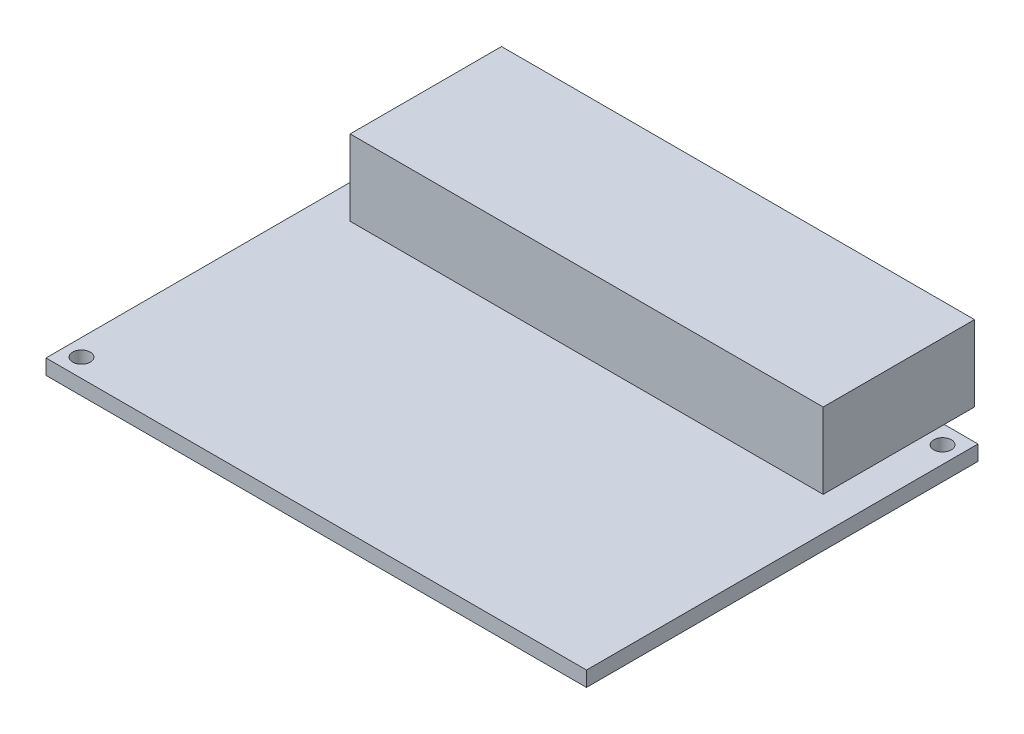
ISO-10303-21;
HEADER;
FILE_DESCRIPTION(('STEP AP214'),'2;1');
FILE_NAME('part.step','',(''),(''),'','','');
FILE_SCHEMA(('AUTOMOTIVE_DESIGN { 1 0 10303 214 1 1 1 1 }'));
ENDSEC;
DATA;
#1=APPLICATION_CONTEXT('core data for automotive mechanical design processes');
#2=APPLICATION_PROTOCOL_DEFINITION('international standard','automotive_design',2000,#1);
#3=PRODUCT_CONTEXT('',#1,'mechanical');
#4=PRODUCT('Part','Part','',(#3));
#5=PRODUCT_RELATED_PRODUCT_CATEGORY('part','',(#4));
#6=PRODUCT_DEFINITION_FORMATION('','',#4);
#7=PRODUCT_DEFINITION_CONTEXT('part definition',#1,'design');
#8=PRODUCT_DEFINITION('design','',#6,#7);
#9=PRODUCT_DEFINITION_SHAPE('','',#8);
#10=(LENGTH_UNIT() NAMED_UNIT(*) SI_UNIT(.MILLI.,.METRE.));
#11=(NAMED_UNIT(*) PLANE_ANGLE_UNIT() SI_UNIT($,.RADIAN.));
#12=(NAMED_UNIT(*) SI_UNIT($,.STERADIAN.) SOLID_ANGLE_UNIT());
#13=UNCERTAINTY_MEASURE_WITH_UNIT(LENGTH_MEASURE(1.E-05),#10,'distance_accuracy_value','');
#14=(GEOMETRIC_REPRESENTATION_CONTEXT(3) GLOBAL_UNCERTAINTY_ASSIGNED_CONTEXT((#13)) GLOBAL_UNIT_ASSIGNED_CONTEXT((#10,
#11,#12)) REPRESENTATION_CONTEXT('',''));
#15=CARTESIAN_POINT('',(0.,0.,0.));
#16=DIRECTION('',(0.,0.,1.));
#17=DIRECTION('',(1.,0.,0.));
#18=AXIS2_PLACEMENT_3D('',#15,#16,#17);
#19=CARTESIAN_POINT('',(0.,2.54,0.));
#20=DIRECTION('',(0.,-1.,0.));
#21=DIRECTION('',(0.,0.,-1.));
#22=AXIS2_PLACEMENT_3D('',#19,#20,#21);
#23=PLANE('',#22);
#24=CARTESIAN_POINT('',(-42.4999999999999,2.54,29.75));
#25=DIRECTION('',(0.,1.,0.));
#26=DIRECTION('',(0.,0.,1.));
#27=AXIS2_PLACEMENT_3D('',#24,#25,#26);
#28=CIRCLE('',#27,1.4732);
#29=CARTESIAN_POINT('',(-42.4999999999999,2.54,31.2232));
#30=VERTEX_POINT('',#29);
#31=EDGE_CURVE('E127',#30,#30,#28,.T.);
#32=ORIENTED_EDGE('',*,*,#31,.F.);
#33=EDGE_LOOP('',(#32));
#34=FACE_BOUND('',#33,.T.);
#35=CARTESIAN_POINT('',(-42.4999999999999,2.54,-29.75));
#36=DIRECTION('',(0.,1.,0.));
#37=DIRECTION('',(0.,0.,1.));
#38=AXIS2_PLACEMENT_3D('',#35,#36,#37);
#39=CIRCLE('',#38,1.4732);
#40=CARTESIAN_POINT('',(-42.4999999999999,2.54,-28.2768));
#41=VERTEX_POINT('',#40);
#42=EDGE_CURVE('E142',#41,#41,#39,.T.);
#43=ORIENTED_EDGE('',*,*,#42,.F.);
#44=EDGE_LOOP('',(#43));
#45=FACE_BOUND('',#44,.T.);
#46=CARTESIAN_POINT('',(42.5000000000001,2.54,-29.7500000000001));
#47=DIRECTION('',(0.,1.,0.));
#48=DIRECTION('',(0.,0.,1.));
#49=AXIS2_PLACEMENT_3D('',#46,#47,#48);
#50=CIRCLE('',#49,1.4732);
#51=CARTESIAN_POINT('',(42.5000000000001,2.54,-28.2768000000001));
#52=VERTEX_POINT('',#51);
#53=EDGE_CURVE('E136',#52,#52,#50,.T.);
#54=ORIENTED_EDGE('',*,*,#53,.F.);
#55=EDGE_LOOP('',(#54));
#56=FACE_BOUND('',#55,.T.);
#57=DIRECTION('',(0.,0.,1.));
#58=VECTOR('',#57,1.);
#59=CARTESIAN_POINT('',(-39.6875,2.54,-12.53));
#60=LINE('',#59,#58);
#61=CARTESIAN_POINT('',(-39.6875,2.54,-32.85));
#62=VERTEX_POINT('',#61);
#63=CARTESIAN_POINT('',(-39.6875,2.54,-12.53));
#64=VERTEX_POINT('',#63);
#65=EDGE_CURVE('E11',#62,#64,#60,.T.);
#66=ORIENTED_EDGE('',*,*,#65,.F.);
#67=DIRECTION('',(-1.,0.,0.));
#68=VECTOR('',#67,1.);
#69=CARTESIAN_POINT('',(-45.3499999999999,2.54,-32.85));
#70=LINE('',#69,#68);
#71=CARTESIAN_POINT('',(-45.3499999999999,2.54,-32.85));
#72=VERTEX_POINT('',#71);
#73=EDGE_CURVE('E151',#62,#72,#70,.T.);
#74=ORIENTED_EDGE('',*,*,#73,.T.);
#75=DIRECTION('',(0.,0.,1.));
#76=VECTOR('',#75,1.);
#77=CARTESIAN_POINT('',(-45.3499999999999,2.54,32.85));
#78=LINE('',#77,#76);
#79=CARTESIAN_POINT('',(-45.3499999999999,2.54,32.85));
#80=VERTEX_POINT('',#79);
#81=EDGE_CURVE('E156',#72,#80,#78,.T.);
#82=ORIENTED_EDGE('',*,*,#81,.T.);
#83=DIRECTION('',(1.,0.,0.));
#84=VECTOR('',#83,1.);
#85=CARTESIAN_POINT('',(-45.3499999999999,2.54,32.85));
#86=LINE('',#85,#84);
#87=CARTESIAN_POINT('',(45.3500000000001,2.54,32.85));
#88=VERTEX_POINT('',#87);
#89=EDGE_CURVE('E159',#80,#88,#86,.T.);
#90=ORIENTED_EDGE('',*,*,#89,.T.);
#91=DIRECTION('',(0.,0.,-1.));
#92=VECTOR('',#91,1.);
#93=CARTESIAN_POINT('',(45.3500000000001,2.54,32.85));
#94=LINE('',#93,#92);
#95=CARTESIAN_POINT('',(45.3500000000001,2.54,-32.85));
#96=VERTEX_POINT('',#95);
#97=EDGE_CURVE('E148',#88,#96,#94,.T.);
#98=ORIENTED_EDGE('',*,*,#97,.T.);
#99=CARTESIAN_POINT('',(39.6875,2.54,-32.85));
#100=VERTEX_POINT('',#99);
#101=EDGE_CURVE('E153',#96,#100,#70,.T.);
#102=ORIENTED_EDGE('',*,*,#101,.T.);
#103=DIRECTION('',(0.,0.,-1.));
#104=VECTOR('',#103,1.);
#105=CARTESIAN_POINT('',(39.6875,2.54,-12.53));
#106=LINE('',#105,#104);
#107=CARTESIAN_POINT('',(39.6875,2.54,-12.53));
#108=VERTEX_POINT('',#107);
#109=EDGE_CURVE('E209',#108,#100,#106,.T.);
#110=ORIENTED_EDGE('',*,*,#109,.F.);
#111=DIRECTION('',(1.,0.,0.));
#112=VECTOR('',#111,1.);
#113=CARTESIAN_POINT('',(39.6875,2.54,-12.53));
#114=LINE('',#113,#112);
#115=EDGE_CURVE('E49',#64,#108,#114,.T.);
#116=ORIENTED_EDGE('',*,*,#115,.F.);
#117=EDGE_LOOP('',(#66,#74,#82,#90,#98,#102,#110,#116));
#118=FACE_BOUND('',#117,.T.);
#119=ADVANCED_FACE('F32',(#34,#45,#56,#118),#23,.F.);
#120=CARTESIAN_POINT('',(0.,0.,0.));
#121=DIRECTION('',(0.,-1.,0.));
#122=DIRECTION('',(0.,0.,-1.));
#123=AXIS2_PLACEMENT_3D('',#120,#121,#122);
#124=PLANE('',#123);
#125=CARTESIAN_POINT('',(42.5000000000001,0.,-29.7500000000001));
#126=DIRECTION('',(0.,1.,0.));
#127=DIRECTION('',(0.,0.,1.));
#128=AXIS2_PLACEMENT_3D('',#125,#126,#127);
#129=CIRCLE('',#128,1.4732);
#130=CARTESIAN_POINT('',(42.5000000000001,0.,-28.2768000000001));
#131=VERTEX_POINT('',#130);
#132=EDGE_CURVE('E134',#131,#131,#129,.T.);
#133=ORIENTED_EDGE('',*,*,#132,.T.);
#134=EDGE_LOOP('',(#133));
#135=FACE_BOUND('',#134,.T.);
#136=DIRECTION('',(0.,0.,-1.));
#137=VECTOR('',#136,1.);
#138=CARTESIAN_POINT('',(45.3500000000001,0.,32.85));
#139=LINE('',#138,#137);
#140=CARTESIAN_POINT('',(45.3500000000001,0.,32.85));
#141=VERTEX_POINT('',#140);
#142=CARTESIAN_POINT('',(45.3500000000001,0.,-32.85));
#143=VERTEX_POINT('',#142);
#144=EDGE_CURVE('E145',#141,#143,#139,.T.);
#145=ORIENTED_EDGE('',*,*,#144,.F.);
#146=DIRECTION('',(1.,0.,0.));
#147=VECTOR('',#146,1.);
#148=CARTESIAN_POINT('',(-45.3499999999999,0.,32.85));
#149=LINE('',#148,#147);
#150=CARTESIAN_POINT('',(-45.3499999999999,0.,32.85));
#151=VERTEX_POINT('',#150);
#152=EDGE_CURVE('E152',#151,#141,#149,.T.);
#153=ORIENTED_EDGE('',*,*,#152,.F.);
#154=DIRECTION('',(0.,0.,1.));
#155=VECTOR('',#154,1.);
#156=CARTESIAN_POINT('',(-45.3499999999999,0.,32.85));
#157=LINE('',#156,#155);
#158=CARTESIAN_POINT('',(-45.3499999999999,0.,-32.85));
#159=VERTEX_POINT('',#158);
#160=EDGE_CURVE('E166',#159,#151,#157,.T.);
#161=ORIENTED_EDGE('',*,*,#160,.F.);
#162=DIRECTION('',(-1.,0.,0.));
#163=VECTOR('',#162,1.);
#164=CARTESIAN_POINT('',(-45.3499999999999,0.,-32.85));
#165=LINE('',#164,#163);
#166=EDGE_CURVE('E164',#143,#159,#165,.T.);
#167=ORIENTED_EDGE('',*,*,#166,.F.);
#168=EDGE_LOOP('',(#145,#153,#161,#167));
#169=FACE_BOUND('',#168,.T.);
#170=CARTESIAN_POINT('',(-42.4999999999999,0.,-29.75));
#171=DIRECTION('',(0.,1.,0.));
#172=DIRECTION('',(0.,0.,1.));
#173=AXIS2_PLACEMENT_3D('',#170,#171,#172);
#174=CIRCLE('',#173,1.4732);
#175=CARTESIAN_POINT('',(-42.4999999999999,0.,-28.2768));
#176=VERTEX_POINT('',#175);
#177=EDGE_CURVE('E139',#176,#176,#174,.T.);
#178=ORIENTED_EDGE('',*,*,#177,.T.);
#179=EDGE_LOOP('',(#178));
#180=FACE_BOUND('',#179,.T.);
#181=CARTESIAN_POINT('',(-42.4999999999999,0.,29.75));
#182=DIRECTION('',(0.,1.,0.));
#183=DIRECTION('',(0.,0.,1.));
#184=AXIS2_PLACEMENT_3D('',#181,#182,#183);
#185=CIRCLE('',#184,1.4732);
#186=CARTESIAN_POINT('',(-42.4999999999999,0.,31.2232));
#187=VERTEX_POINT('',#186);
#188=EDGE_CURVE('E124',#187,#187,#185,.T.);
#189=ORIENTED_EDGE('',*,*,#188,.T.);
#190=EDGE_LOOP('',(#189));
#191=FACE_BOUND('',#190,.T.);
#192=ADVANCED_FACE('F189',(#135,#169,#180,#191),#124,.T.);
#193=CARTESIAN_POINT('',(45.3500000000001,2.54,32.85));
#194=DIRECTION('',(-1.,0.,0.));
#195=DIRECTION('',(0.,0.,1.));
#196=AXIS2_PLACEMENT_3D('',#193,#194,#195);
#197=PLANE('',#196);
#198=ORIENTED_EDGE('',*,*,#144,.T.);
#199=DIRECTION('',(0.,-1.,0.));
#200=VECTOR('',#199,1.);
#201=CARTESIAN_POINT('',(45.3500000000001,2.54,-32.85));
#202=LINE('',#201,#200);
#203=EDGE_CURVE('E36',#96,#143,#202,.T.);
#204=ORIENTED_EDGE('',*,*,#203,.F.);
#205=ORIENTED_EDGE('',*,*,#97,.F.);
#206=DIRECTION('',(0.,-1.,0.));
#207=VECTOR('',#206,1.);
#208=CARTESIAN_POINT('',(45.3500000000001,2.54,32.85));
#209=LINE('',#208,#207);
#210=EDGE_CURVE('E161',#88,#141,#209,.T.);
#211=ORIENTED_EDGE('',*,*,#210,.T.);
#212=EDGE_LOOP('',(#198,#204,#205,#211));
#213=FACE_BOUND('',#212,.T.);
#214=ADVANCED_FACE('F34',(#213),#197,.F.);
#215=CARTESIAN_POINT('',(-45.3499999999999,2.54,-32.85));
#216=DIRECTION('',(0.,0.,1.));
#217=DIRECTION('',(1.,0.,0.));
#218=AXIS2_PLACEMENT_3D('',#215,#216,#217);
#219=PLANE('',#218);
#220=ORIENTED_EDGE('',*,*,#166,.T.);
#221=DIRECTION('',(0.,-1.,0.));
#222=VECTOR('',#221,1.);
#223=CARTESIAN_POINT('',(-45.3499999999999,2.54,-32.85));
#224=LINE('',#223,#222);
#225=EDGE_CURVE('E173',#72,#159,#224,.T.);
#226=ORIENTED_EDGE('',*,*,#225,.F.);
#227=ORIENTED_EDGE('',*,*,#73,.F.);
#228=EDGE_CURVE('E157',#100,#62,#70,.T.);
#229=ORIENTED_EDGE('',*,*,#228,.F.);
#230=ORIENTED_EDGE('',*,*,#101,.F.);
#231=ORIENTED_EDGE('',*,*,#203,.T.);
#232=EDGE_LOOP('',(#220,#226,#227,#229,#230,#231));
#233=FACE_BOUND('',#232,.T.);
#234=ADVANCED_FACE('F182',(#233),#219,.F.);
#235=CARTESIAN_POINT('',(-45.3499999999999,2.54,32.85));
#236=DIRECTION('',(1.,0.,0.));
#237=DIRECTION('',(0.,0.,-1.));
#238=AXIS2_PLACEMENT_3D('',#235,#236,#237);
#239=PLANE('',#238);
#240=ORIENTED_EDGE('',*,*,#160,.T.);
#241=DIRECTION('',(0.,-1.,0.));
#242=VECTOR('',#241,1.);
#243=CARTESIAN_POINT('',(-45.3499999999999,2.54,32.85));
#244=LINE('',#243,#242);
#245=EDGE_CURVE('E171',#80,#151,#244,.T.);
#246=ORIENTED_EDGE('',*,*,#245,.F.);
#247=ORIENTED_EDGE('',*,*,#81,.F.);
#248=ORIENTED_EDGE('',*,*,#225,.T.);
#249=EDGE_LOOP('',(#240,#246,#247,#248));
#250=FACE_BOUND('',#249,.T.);
#251=ADVANCED_FACE('F192',(#250),#239,.F.);
#252=CARTESIAN_POINT('',(-45.3499999999999,2.54,32.85));
#253=DIRECTION('',(0.,0.,-1.));
#254=DIRECTION('',(-1.,0.,0.));
#255=AXIS2_PLACEMENT_3D('',#252,#253,#254);
#256=PLANE('',#255);
#257=ORIENTED_EDGE('',*,*,#152,.T.);
#258=ORIENTED_EDGE('',*,*,#210,.F.);
#259=ORIENTED_EDGE('',*,*,#89,.F.);
#260=ORIENTED_EDGE('',*,*,#245,.T.);
#261=EDGE_LOOP('',(#257,#258,#259,#260));
#262=FACE_BOUND('',#261,.T.);
#263=ADVANCED_FACE('F195',(#262),#256,.F.);
#264=CARTESIAN_POINT('',(-42.4999999999999,2.54,-29.75));
#265=DIRECTION('',(0.,-1.,0.));
#266=DIRECTION('',(0.,0.,-1.));
#267=AXIS2_PLACEMENT_3D('',#264,#265,#266);
#268=CYLINDRICAL_SURFACE('',#267,1.4732);
#269=ORIENTED_EDGE('',*,*,#42,.T.);
#270=EDGE_LOOP('',(#269));
#271=FACE_BOUND('',#270,.T.);
#272=ORIENTED_EDGE('',*,*,#177,.F.);
#273=EDGE_LOOP('',(#272));
#274=FACE_BOUND('',#273,.T.);
#275=ADVANCED_FACE('F237',(#271,#274),#268,.F.);
#276=CARTESIAN_POINT('',(42.5000000000001,2.54,-29.7500000000001));
#277=DIRECTION('',(0.,-1.,0.));
#278=DIRECTION('',(0.,0.,-1.));
#279=AXIS2_PLACEMENT_3D('',#276,#277,#278);
#280=CYLINDRICAL_SURFACE('',#279,1.4732);
#281=ORIENTED_EDGE('',*,*,#53,.T.);
#282=EDGE_LOOP('',(#281));
#283=FACE_BOUND('',#282,.T.);
#284=ORIENTED_EDGE('',*,*,#132,.F.);
#285=EDGE_LOOP('',(#284));
#286=FACE_BOUND('',#285,.T.);
#287=ADVANCED_FACE('F280',(#283,#286),#280,.F.);
#288=CARTESIAN_POINT('',(-42.4999999999999,2.54,29.75));
#289=DIRECTION('',(0.,-1.,0.));
#290=DIRECTION('',(0.,0.,-1.));
#291=AXIS2_PLACEMENT_3D('',#288,#289,#290);
#292=CYLINDRICAL_SURFACE('',#291,1.4732);
#293=ORIENTED_EDGE('',*,*,#31,.T.);
#294=EDGE_LOOP('',(#293));
#295=FACE_BOUND('',#294,.T.);
#296=ORIENTED_EDGE('',*,*,#188,.F.);
#297=EDGE_LOOP('',(#296));
#298=FACE_BOUND('',#297,.T.);
#299=ADVANCED_FACE('F288',(#295,#298),#292,.F.);
#300=CARTESIAN_POINT('',(0.,2.54,0.));
#301=DIRECTION('',(0.,1.,0.));
#302=DIRECTION('',(0.,0.,1.));
#303=AXIS2_PLACEMENT_3D('',#300,#301,#302);
#304=PLANE('',#303);
#305=CARTESIAN_POINT('',(39.6875,2.54,-37.93));
#306=VERTEX_POINT('',#305);
#307=EDGE_CURVE('E202',#100,#306,#106,.T.);
#308=ORIENTED_EDGE('',*,*,#307,.F.);
#309=ORIENTED_EDGE('',*,*,#228,.T.);
#310=CARTESIAN_POINT('',(-39.6875,2.54,-37.93));
#311=VERTEX_POINT('',#310);
#312=EDGE_CURVE('E42',#311,#62,#60,.T.);
#313=ORIENTED_EDGE('',*,*,#312,.F.);
#314=DIRECTION('',(-1.,0.,0.));
#315=VECTOR('',#314,1.);
#316=CARTESIAN_POINT('',(39.6875,2.54,-37.93));
#317=LINE('',#316,#315);
#318=EDGE_CURVE('E120',#306,#311,#317,.T.);
#319=ORIENTED_EDGE('',*,*,#318,.F.);
#320=EDGE_LOOP('',(#308,#309,#313,#319));
#321=FACE_BOUND('',#320,.T.);
#322=ADVANCED_FACE('F200',(#321),#304,.F.);
#323=CARTESIAN_POINT('',(-39.6875,15.24,-12.53));
#324=DIRECTION('',(1.,0.,0.));
#325=DIRECTION('',(0.,0.,-1.));
#326=AXIS2_PLACEMENT_3D('',#323,#324,#325);
#327=PLANE('',#326);
#328=ORIENTED_EDGE('',*,*,#312,.T.);
#329=ORIENTED_EDGE('',*,*,#65,.T.);
#330=DIRECTION('',(0.,-1.,0.));
#331=VECTOR('',#330,1.);
#332=CARTESIAN_POINT('',(-39.6875,15.24,-12.53));
#333=LINE('',#332,#331);
#334=CARTESIAN_POINT('',(-39.6875,15.24,-12.53));
#335=VERTEX_POINT('',#334);
#336=EDGE_CURVE('E105',#335,#64,#333,.T.);
#337=ORIENTED_EDGE('',*,*,#336,.F.);
#338=DIRECTION('',(0.,0.,1.));
#339=VECTOR('',#338,1.);
#340=CARTESIAN_POINT('',(-39.6875,15.24,-12.53));
#341=LINE('',#340,#339);
#342=CARTESIAN_POINT('',(-39.6875,15.24,-37.93));
#343=VERTEX_POINT('',#342);
#344=EDGE_CURVE('E111',#343,#335,#341,.T.);
#345=ORIENTED_EDGE('',*,*,#344,.F.);
#346=DIRECTION('',(0.,-1.,0.));
#347=VECTOR('',#346,1.);
#348=CARTESIAN_POINT('',(-39.6875,15.24,-37.93));
#349=LINE('',#348,#347);
#350=EDGE_CURVE('E204',#343,#311,#349,.T.);
#351=ORIENTED_EDGE('',*,*,#350,.T.);
#352=EDGE_LOOP('',(#328,#329,#337,#345,#351));
#353=FACE_BOUND('',#352,.T.);
#354=ADVANCED_FACE('F123',(#353),#327,.F.);
#355=CARTESIAN_POINT('',(39.6875,15.24,-12.53));
#356=DIRECTION('',(0.,0.,-1.));
#357=DIRECTION('',(-1.,0.,0.));
#358=AXIS2_PLACEMENT_3D('',#355,#356,#357);
#359=PLANE('',#358);
#360=ORIENTED_EDGE('',*,*,#115,.T.);
#361=DIRECTION('',(0.,-1.,0.));
#362=VECTOR('',#361,1.);
#363=CARTESIAN_POINT('',(39.6875,15.24,-12.53));
#364=LINE('',#363,#362);
#365=CARTESIAN_POINT('',(39.6875,15.24,-12.53));
#366=VERTEX_POINT('',#365);
#367=EDGE_CURVE('E107',#366,#108,#364,.T.);
#368=ORIENTED_EDGE('',*,*,#367,.F.);
#369=DIRECTION('',(1.,0.,0.));
#370=VECTOR('',#369,1.);
#371=CARTESIAN_POINT('',(39.6875,15.24,-12.53));
#372=LINE('',#371,#370);
#373=EDGE_CURVE('E101',#335,#366,#372,.T.);
#374=ORIENTED_EDGE('',*,*,#373,.F.);
#375=ORIENTED_EDGE('',*,*,#336,.T.);
#376=EDGE_LOOP('',(#360,#368,#374,#375));
#377=FACE_BOUND('',#376,.T.);
#378=ADVANCED_FACE('F103',(#377),#359,.F.);
#379=CARTESIAN_POINT('',(39.6875,15.24,-12.53));
#380=DIRECTION('',(-1.,0.,0.));
#381=DIRECTION('',(0.,0.,1.));
#382=AXIS2_PLACEMENT_3D('',#379,#380,#381);
#383=PLANE('',#382);
#384=ORIENTED_EDGE('',*,*,#109,.T.);
#385=ORIENTED_EDGE('',*,*,#307,.T.);
#386=DIRECTION('',(0.,-1.,0.));
#387=VECTOR('',#386,1.);
#388=CARTESIAN_POINT('',(39.6875,15.24,-37.93));
#389=LINE('',#388,#387);
#390=CARTESIAN_POINT('',(39.6875,15.24,-37.93));
#391=VERTEX_POINT('',#390);
#392=EDGE_CURVE('E129',#391,#306,#389,.T.);
#393=ORIENTED_EDGE('',*,*,#392,.F.);
#394=DIRECTION('',(0.,0.,-1.));
#395=VECTOR('',#394,1.);
#396=CARTESIAN_POINT('',(39.6875,15.24,-12.53));
#397=LINE('',#396,#395);
#398=EDGE_CURVE('E110',#366,#391,#397,.T.);
#399=ORIENTED_EDGE('',*,*,#398,.F.);
#400=ORIENTED_EDGE('',*,*,#367,.T.);
#401=EDGE_LOOP('',(#384,#385,#393,#399,#400));
#402=FACE_BOUND('',#401,.T.);
#403=ADVANCED_FACE('F217',(#402),#383,.F.);
#404=CARTESIAN_POINT('',(39.6875,15.24,-37.93));
#405=DIRECTION('',(0.,0.,1.));
#406=DIRECTION('',(1.,0.,0.));
#407=AXIS2_PLACEMENT_3D('',#404,#405,#406);
#408=PLANE('',#407);
#409=ORIENTED_EDGE('',*,*,#318,.T.);
#410=ORIENTED_EDGE('',*,*,#350,.F.);
#411=DIRECTION('',(-1.,0.,0.));
#412=VECTOR('',#411,1.);
#413=CARTESIAN_POINT('',(39.6875,15.24,-37.93));
#414=LINE('',#413,#412);
#415=EDGE_CURVE('E116',#391,#343,#414,.T.);
#416=ORIENTED_EDGE('',*,*,#415,.F.);
#417=ORIENTED_EDGE('',*,*,#392,.T.);
#418=EDGE_LOOP('',(#409,#410,#416,#417));
#419=FACE_BOUND('',#418,.T.);
#420=ADVANCED_FACE('F215',(#419),#408,.F.);
#421=CARTESIAN_POINT('',(0.,15.24,0.));
#422=DIRECTION('',(0.,1.,0.));
#423=DIRECTION('',(0.,0.,1.));
#424=AXIS2_PLACEMENT_3D('',#421,#422,#423);
#425=PLANE('',#424);
#426=ORIENTED_EDGE('',*,*,#344,.T.);
#427=ORIENTED_EDGE('',*,*,#373,.T.);
#428=ORIENTED_EDGE('',*,*,#398,.T.);
#429=ORIENTED_EDGE('',*,*,#415,.T.);
#430=EDGE_LOOP('',(#426,#427,#428,#429));
#431=FACE_BOUND('',#430,.T.);
#432=ADVANCED_FACE('F114',(#431),#425,.T.);
#433=CLOSED_SHELL('',(#119,#192,#214,#234,#251,#263,#275,#287,#299,#322,#354,#378,#403,#420,#432));
#434=MANIFOLD_SOLID_BREP('B2',#433);
#435=ADVANCED_BREP_SHAPE_REPRESENTATION('',(#18,#434),#14);
#436=SHAPE_DEFINITION_REPRESENTATION(#9,#435);
ENDSEC;
END-ISO-10303-21;
